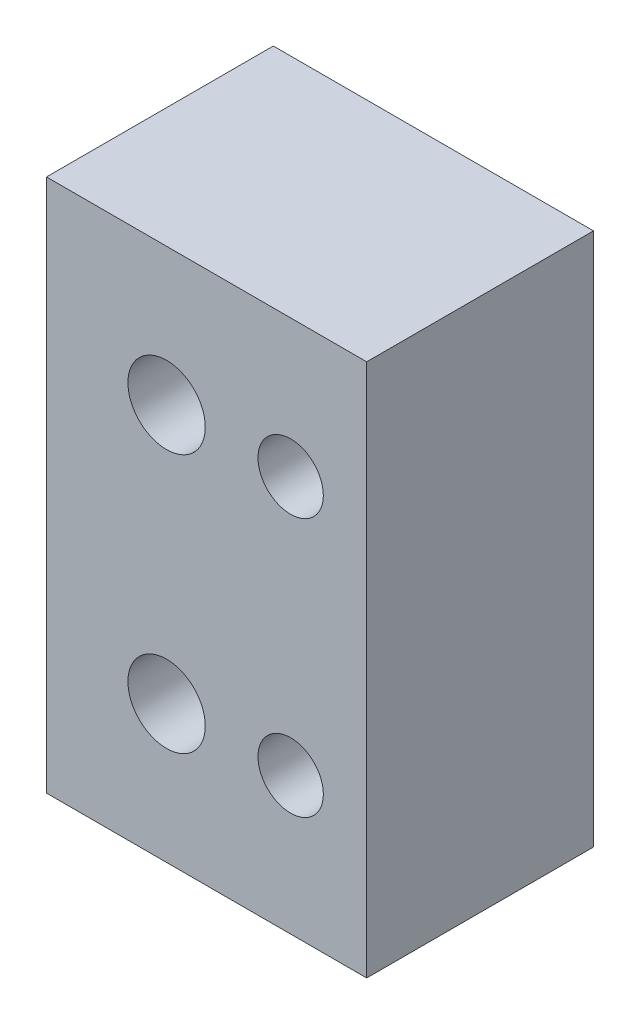
ISO-10303-21;
HEADER;
FILE_DESCRIPTION(('STEP AP214'),'2;1');
FILE_NAME('part.step','',(''),(''),'','','');
FILE_SCHEMA(('AUTOMOTIVE_DESIGN { 1 0 10303 214 1 1 1 1 }'));
ENDSEC;
DATA;
#1=APPLICATION_CONTEXT('core data for automotive mechanical design processes');
#2=APPLICATION_PROTOCOL_DEFINITION('international standard','automotive_design',2000,#1);
#3=PRODUCT_CONTEXT('',#1,'mechanical');
#4=PRODUCT('Part','Part','',(#3));
#5=PRODUCT_RELATED_PRODUCT_CATEGORY('part','',(#4));
#6=PRODUCT_DEFINITION_FORMATION('','',#4);
#7=PRODUCT_DEFINITION_CONTEXT('part definition',#1,'design');
#8=PRODUCT_DEFINITION('design','',#6,#7);
#9=PRODUCT_DEFINITION_SHAPE('','',#8);
#10=(LENGTH_UNIT() NAMED_UNIT(*) SI_UNIT(.MILLI.,.METRE.));
#11=(NAMED_UNIT(*) PLANE_ANGLE_UNIT() SI_UNIT($,.RADIAN.));
#12=(NAMED_UNIT(*) SI_UNIT($,.STERADIAN.) SOLID_ANGLE_UNIT());
#13=UNCERTAINTY_MEASURE_WITH_UNIT(LENGTH_MEASURE(1.E-05),#10,'distance_accuracy_value','');
#14=(GEOMETRIC_REPRESENTATION_CONTEXT(3) GLOBAL_UNCERTAINTY_ASSIGNED_CONTEXT((#13)) GLOBAL_UNIT_ASSIGNED_CONTEXT((#10,
#11,#12)) REPRESENTATION_CONTEXT('',''));
#15=CARTESIAN_POINT('',(0.,0.,0.));
#16=DIRECTION('',(0.,0.,1.));
#17=DIRECTION('',(1.,0.,0.));
#18=AXIS2_PLACEMENT_3D('',#15,#16,#17);
#19=CARTESIAN_POINT('',(0.,0.,8.5));
#20=DIRECTION('',(0.,0.,1.));
#21=DIRECTION('',(1.,0.,0.));
#22=AXIS2_PLACEMENT_3D('',#19,#20,#21);
#23=PLANE('',#22);
#24=CARTESIAN_POINT('',(9.14999999999999,14.85,8.5));
#25=DIRECTION('',(0.,0.,1.));
#26=DIRECTION('',(1.,0.,0.));
#27=AXIS2_PLACEMENT_3D('',#24,#25,#26);
#28=CIRCLE('',#27,1.225);
#29=CARTESIAN_POINT('',(10.375,14.85,8.5));
#30=VERTEX_POINT('',#29);
#31=EDGE_CURVE('E124',#30,#30,#28,.T.);
#32=ORIENTED_EDGE('',*,*,#31,.F.);
#33=EDGE_LOOP('',(#32));
#34=FACE_BOUND('',#33,.T.);
#35=CARTESIAN_POINT('',(4.50000000000017,14.8499999999991,8.5));
#36=DIRECTION('',(0.,0.,1.));
#37=DIRECTION('',(1.,0.,0.));
#38=AXIS2_PLACEMENT_3D('',#35,#36,#37);
#39=CIRCLE('',#38,1.45);
#40=CARTESIAN_POINT('',(5.95000000000017,14.8499999999991,8.5));
#41=VERTEX_POINT('',#40);
#42=EDGE_CURVE('E103',#41,#41,#39,.T.);
#43=ORIENTED_EDGE('',*,*,#42,.F.);
#44=EDGE_LOOP('',(#43));
#45=FACE_BOUND('',#44,.T.);
#46=DIRECTION('',(0.,-1.,0.));
#47=VECTOR('',#46,1.);
#48=CARTESIAN_POINT('',(8.88178419700125E-13,19.9999999999996,8.5));
#49=LINE('',#48,#47);
#50=CARTESIAN_POINT('',(8.88178419700125E-13,19.9999999999996,8.5));
#51=VERTEX_POINT('',#50);
#52=CARTESIAN_POINT('',(0.,0.,8.5));
#53=VERTEX_POINT('',#52);
#54=EDGE_CURVE('E88',#51,#53,#49,.T.);
#55=ORIENTED_EDGE('',*,*,#54,.T.);
#56=DIRECTION('',(1.,0.,0.));
#57=VECTOR('',#56,1.);
#58=CARTESIAN_POINT('',(0.,0.,8.5));
#59=LINE('',#58,#57);
#60=CARTESIAN_POINT('',(12.0000000000009,0.,8.5));
#61=VERTEX_POINT('',#60);
#62=EDGE_CURVE('E83',#53,#61,#59,.T.);
#63=ORIENTED_EDGE('',*,*,#62,.T.);
#64=DIRECTION('',(0.,1.,0.));
#65=VECTOR('',#64,1.);
#66=CARTESIAN_POINT('',(12.0000000000009,19.9999999999996,8.5));
#67=LINE('',#66,#65);
#68=CARTESIAN_POINT('',(12.0000000000009,19.9999999999996,8.5));
#69=VERTEX_POINT('',#68);
#70=EDGE_CURVE('E86',#61,#69,#67,.T.);
#71=ORIENTED_EDGE('',*,*,#70,.T.);
#72=DIRECTION('',(-1.,0.,0.));
#73=VECTOR('',#72,1.);
#74=CARTESIAN_POINT('',(8.88178419700125E-13,19.9999999999996,8.5));
#75=LINE('',#74,#73);
#76=EDGE_CURVE('E53',#69,#51,#75,.T.);
#77=ORIENTED_EDGE('',*,*,#76,.T.);
#78=EDGE_LOOP('',(#55,#63,#71,#77));
#79=FACE_BOUND('',#78,.T.);
#80=CARTESIAN_POINT('',(4.50000000000061,5.14999999999954,8.5));
#81=DIRECTION('',(0.,0.,1.));
#82=DIRECTION('',(1.,0.,0.));
#83=AXIS2_PLACEMENT_3D('',#80,#81,#82);
#84=CIRCLE('',#83,1.45);
#85=CARTESIAN_POINT('',(5.95000000000061,5.14999999999954,8.5));
#86=VERTEX_POINT('',#85);
#87=EDGE_CURVE('E118',#86,#86,#84,.T.);
#88=ORIENTED_EDGE('',*,*,#87,.F.);
#89=EDGE_LOOP('',(#88));
#90=FACE_BOUND('',#89,.T.);
#91=CARTESIAN_POINT('',(9.15000000000044,5.14999999999954,8.5));
#92=DIRECTION('',(0.,0.,1.));
#93=DIRECTION('',(1.,0.,0.));
#94=AXIS2_PLACEMENT_3D('',#91,#92,#93);
#95=CIRCLE('',#94,1.225);
#96=CARTESIAN_POINT('',(10.3750000000004,5.14999999999954,8.5));
#97=VERTEX_POINT('',#96);
#98=EDGE_CURVE('E130',#97,#97,#95,.T.);
#99=ORIENTED_EDGE('',*,*,#98,.F.);
#100=EDGE_LOOP('',(#99));
#101=FACE_BOUND('',#100,.T.);
#102=ADVANCED_FACE('F36',(#34,#45,#79,#90,#101),#23,.T.);
#103=CARTESIAN_POINT('',(0.,0.,0.));
#104=DIRECTION('',(0.,0.,1.));
#105=DIRECTION('',(1.,0.,0.));
#106=AXIS2_PLACEMENT_3D('',#103,#104,#105);
#107=PLANE('',#106);
#108=CARTESIAN_POINT('',(9.14999999999999,14.85,0.));
#109=DIRECTION('',(0.,0.,1.));
#110=DIRECTION('',(1.,0.,0.));
#111=AXIS2_PLACEMENT_3D('',#108,#109,#110);
#112=CIRCLE('',#111,1.225);
#113=CARTESIAN_POINT('',(10.375,14.85,0.));
#114=VERTEX_POINT('',#113);
#115=EDGE_CURVE('E127',#114,#114,#112,.T.);
#116=ORIENTED_EDGE('',*,*,#115,.T.);
#117=EDGE_LOOP('',(#116));
#118=FACE_BOUND('',#117,.T.);
#119=CARTESIAN_POINT('',(4.50000000000017,14.8499999999991,0.));
#120=DIRECTION('',(0.,0.,1.));
#121=DIRECTION('',(1.,0.,0.));
#122=AXIS2_PLACEMENT_3D('',#119,#120,#121);
#123=CIRCLE('',#122,1.45);
#124=CARTESIAN_POINT('',(5.95000000000017,14.8499999999991,0.));
#125=VERTEX_POINT('',#124);
#126=EDGE_CURVE('E115',#125,#125,#123,.T.);
#127=ORIENTED_EDGE('',*,*,#126,.T.);
#128=EDGE_LOOP('',(#127));
#129=FACE_BOUND('',#128,.T.);
#130=DIRECTION('',(0.,-1.,0.));
#131=VECTOR('',#130,1.);
#132=CARTESIAN_POINT('',(8.88178419700125E-13,19.9999999999996,0.));
#133=LINE('',#132,#131);
#134=CARTESIAN_POINT('',(8.88178419700125E-13,19.9999999999996,0.));
#135=VERTEX_POINT('',#134);
#136=CARTESIAN_POINT('',(0.,0.,0.));
#137=VERTEX_POINT('',#136);
#138=EDGE_CURVE('E100',#135,#137,#133,.T.);
#139=ORIENTED_EDGE('',*,*,#138,.F.);
#140=DIRECTION('',(-1.,0.,0.));
#141=VECTOR('',#140,1.);
#142=CARTESIAN_POINT('',(8.88178419700125E-13,19.9999999999996,0.));
#143=LINE('',#142,#141);
#144=CARTESIAN_POINT('',(12.0000000000009,19.9999999999996,0.));
#145=VERTEX_POINT('',#144);
#146=EDGE_CURVE('E76',#145,#135,#143,.T.);
#147=ORIENTED_EDGE('',*,*,#146,.F.);
#148=DIRECTION('',(0.,1.,0.));
#149=VECTOR('',#148,1.);
#150=CARTESIAN_POINT('',(12.0000000000009,19.9999999999996,0.));
#151=LINE('',#150,#149);
#152=CARTESIAN_POINT('',(12.0000000000009,0.,0.));
#153=VERTEX_POINT('',#152);
#154=EDGE_CURVE('E70',#153,#145,#151,.T.);
#155=ORIENTED_EDGE('',*,*,#154,.F.);
#156=DIRECTION('',(1.,0.,0.));
#157=VECTOR('',#156,1.);
#158=CARTESIAN_POINT('',(0.,0.,0.));
#159=LINE('',#158,#157);
#160=EDGE_CURVE('E92',#137,#153,#159,.T.);
#161=ORIENTED_EDGE('',*,*,#160,.F.);
#162=EDGE_LOOP('',(#139,#147,#155,#161));
#163=FACE_BOUND('',#162,.T.);
#164=CARTESIAN_POINT('',(4.50000000000061,5.14999999999954,0.));
#165=DIRECTION('',(0.,0.,1.));
#166=DIRECTION('',(1.,0.,0.));
#167=AXIS2_PLACEMENT_3D('',#164,#165,#166);
#168=CIRCLE('',#167,1.45);
#169=CARTESIAN_POINT('',(5.95000000000061,5.14999999999954,0.));
#170=VERTEX_POINT('',#169);
#171=EDGE_CURVE('E121',#170,#170,#168,.T.);
#172=ORIENTED_EDGE('',*,*,#171,.T.);
#173=EDGE_LOOP('',(#172));
#174=FACE_BOUND('',#173,.T.);
#175=CARTESIAN_POINT('',(9.15000000000044,5.14999999999954,0.));
#176=DIRECTION('',(0.,0.,1.));
#177=DIRECTION('',(1.,0.,0.));
#178=AXIS2_PLACEMENT_3D('',#175,#176,#177);
#179=CIRCLE('',#178,1.225);
#180=CARTESIAN_POINT('',(10.3750000000004,5.14999999999954,0.));
#181=VERTEX_POINT('',#180);
#182=EDGE_CURVE('E133',#181,#181,#179,.T.);
#183=ORIENTED_EDGE('',*,*,#182,.T.);
#184=EDGE_LOOP('',(#183));
#185=FACE_BOUND('',#184,.T.);
#186=ADVANCED_FACE('F111',(#118,#129,#163,#174,#185),#107,.F.);
#187=CARTESIAN_POINT('',(8.88178419700125E-13,19.9999999999996,8.5));
#188=DIRECTION('',(1.,0.,0.));
#189=DIRECTION('',(0.,1.,0.));
#190=AXIS2_PLACEMENT_3D('',#187,#188,#189);
#191=PLANE('',#190);
#192=ORIENTED_EDGE('',*,*,#138,.T.);
#193=DIRECTION('',(0.,0.,-1.));
#194=VECTOR('',#193,1.);
#195=CARTESIAN_POINT('',(0.,0.,8.5));
#196=LINE('',#195,#194);
#197=EDGE_CURVE('E11',#53,#137,#196,.T.);
#198=ORIENTED_EDGE('',*,*,#197,.F.);
#199=ORIENTED_EDGE('',*,*,#54,.F.);
#200=DIRECTION('',(0.,0.,-1.));
#201=VECTOR('',#200,1.);
#202=CARTESIAN_POINT('',(8.88178419700125E-13,19.9999999999996,8.5));
#203=LINE('',#202,#201);
#204=EDGE_CURVE('E96',#51,#135,#203,.T.);
#205=ORIENTED_EDGE('',*,*,#204,.T.);
#206=EDGE_LOOP('',(#192,#198,#199,#205));
#207=FACE_BOUND('',#206,.T.);
#208=ADVANCED_FACE('F38',(#207),#191,.F.);
#209=CARTESIAN_POINT('',(0.,0.,8.5));
#210=DIRECTION('',(0.,1.,0.));
#211=DIRECTION('',(0.,0.,1.));
#212=AXIS2_PLACEMENT_3D('',#209,#210,#211);
#213=PLANE('',#212);
#214=ORIENTED_EDGE('',*,*,#160,.T.);
#215=DIRECTION('',(0.,0.,-1.));
#216=VECTOR('',#215,1.);
#217=CARTESIAN_POINT('',(12.0000000000009,0.,8.5));
#218=LINE('',#217,#216);
#219=EDGE_CURVE('E45',#61,#153,#218,.T.);
#220=ORIENTED_EDGE('',*,*,#219,.F.);
#221=ORIENTED_EDGE('',*,*,#62,.F.);
#222=ORIENTED_EDGE('',*,*,#197,.T.);
#223=EDGE_LOOP('',(#214,#220,#221,#222));
#224=FACE_BOUND('',#223,.T.);
#225=ADVANCED_FACE('F91',(#224),#213,.F.);
#226=CARTESIAN_POINT('',(12.0000000000009,19.9999999999996,8.5));
#227=DIRECTION('',(-1.,0.,0.));
#228=DIRECTION('',(0.,0.,1.));
#229=AXIS2_PLACEMENT_3D('',#226,#227,#228);
#230=PLANE('',#229);
#231=ORIENTED_EDGE('',*,*,#154,.T.);
#232=DIRECTION('',(0.,0.,-1.));
#233=VECTOR('',#232,1.);
#234=CARTESIAN_POINT('',(12.0000000000009,19.9999999999996,8.5));
#235=LINE('',#234,#233);
#236=EDGE_CURVE('E93',#69,#145,#235,.T.);
#237=ORIENTED_EDGE('',*,*,#236,.F.);
#238=ORIENTED_EDGE('',*,*,#70,.F.);
#239=ORIENTED_EDGE('',*,*,#219,.T.);
#240=EDGE_LOOP('',(#231,#237,#238,#239));
#241=FACE_BOUND('',#240,.T.);
#242=ADVANCED_FACE('F94',(#241),#230,.F.);
#243=CARTESIAN_POINT('',(8.88178419700125E-13,19.9999999999996,8.5));
#244=DIRECTION('',(0.,-1.,0.));
#245=DIRECTION('',(0.,0.,-1.));
#246=AXIS2_PLACEMENT_3D('',#243,#244,#245);
#247=PLANE('',#246);
#248=ORIENTED_EDGE('',*,*,#146,.T.);
#249=ORIENTED_EDGE('',*,*,#204,.F.);
#250=ORIENTED_EDGE('',*,*,#76,.F.);
#251=ORIENTED_EDGE('',*,*,#236,.T.);
#252=EDGE_LOOP('',(#248,#249,#250,#251));
#253=FACE_BOUND('',#252,.T.);
#254=ADVANCED_FACE('F108',(#253),#247,.F.);
#255=CARTESIAN_POINT('',(4.50000000000017,14.8499999999991,8.5));
#256=DIRECTION('',(0.,0.,-1.));
#257=DIRECTION('',(-1.,0.,0.));
#258=AXIS2_PLACEMENT_3D('',#255,#256,#257);
#259=CYLINDRICAL_SURFACE('',#258,1.45);
#260=ORIENTED_EDGE('',*,*,#42,.T.);
#261=EDGE_LOOP('',(#260));
#262=FACE_BOUND('',#261,.T.);
#263=ORIENTED_EDGE('',*,*,#126,.F.);
#264=EDGE_LOOP('',(#263));
#265=FACE_BOUND('',#264,.T.);
#266=ADVANCED_FACE('F153',(#262,#265),#259,.F.);
#267=CARTESIAN_POINT('',(4.50000000000061,5.14999999999954,8.5));
#268=DIRECTION('',(0.,0.,-1.));
#269=DIRECTION('',(-1.,0.,0.));
#270=AXIS2_PLACEMENT_3D('',#267,#268,#269);
#271=CYLINDRICAL_SURFACE('',#270,1.45);
#272=ORIENTED_EDGE('',*,*,#87,.T.);
#273=EDGE_LOOP('',(#272));
#274=FACE_BOUND('',#273,.T.);
#275=ORIENTED_EDGE('',*,*,#171,.F.);
#276=EDGE_LOOP('',(#275));
#277=FACE_BOUND('',#276,.T.);
#278=ADVANCED_FACE('F199',(#274,#277),#271,.F.);
#279=CARTESIAN_POINT('',(9.14999999999999,14.85,8.5));
#280=DIRECTION('',(0.,0.,-1.));
#281=DIRECTION('',(-1.,0.,0.));
#282=AXIS2_PLACEMENT_3D('',#279,#280,#281);
#283=CYLINDRICAL_SURFACE('',#282,1.225);
#284=ORIENTED_EDGE('',*,*,#31,.T.);
#285=EDGE_LOOP('',(#284));
#286=FACE_BOUND('',#285,.T.);
#287=ORIENTED_EDGE('',*,*,#115,.F.);
#288=EDGE_LOOP('',(#287));
#289=FACE_BOUND('',#288,.T.);
#290=ADVANCED_FACE('F207',(#286,#289),#283,.F.);
#291=CARTESIAN_POINT('',(9.15000000000044,5.14999999999954,8.5));
#292=DIRECTION('',(0.,0.,-1.));
#293=DIRECTION('',(-1.,0.,0.));
#294=AXIS2_PLACEMENT_3D('',#291,#292,#293);
#295=CYLINDRICAL_SURFACE('',#294,1.225);
#296=ORIENTED_EDGE('',*,*,#98,.T.);
#297=EDGE_LOOP('',(#296));
#298=FACE_BOUND('',#297,.T.);
#299=ORIENTED_EDGE('',*,*,#182,.F.);
#300=EDGE_LOOP('',(#299));
#301=FACE_BOUND('',#300,.T.);
#302=ADVANCED_FACE('F139',(#298,#301),#295,.F.);
#303=CLOSED_SHELL('',(#102,#186,#208,#225,#242,#254,#266,#278,#290,#302));
#304=MANIFOLD_SOLID_BREP('B2',#303);
#305=ADVANCED_BREP_SHAPE_REPRESENTATION('',(#18,#304),#14);
#306=SHAPE_DEFINITION_REPRESENTATION(#9,#305);
ENDSEC;
END-ISO-10303-21;
